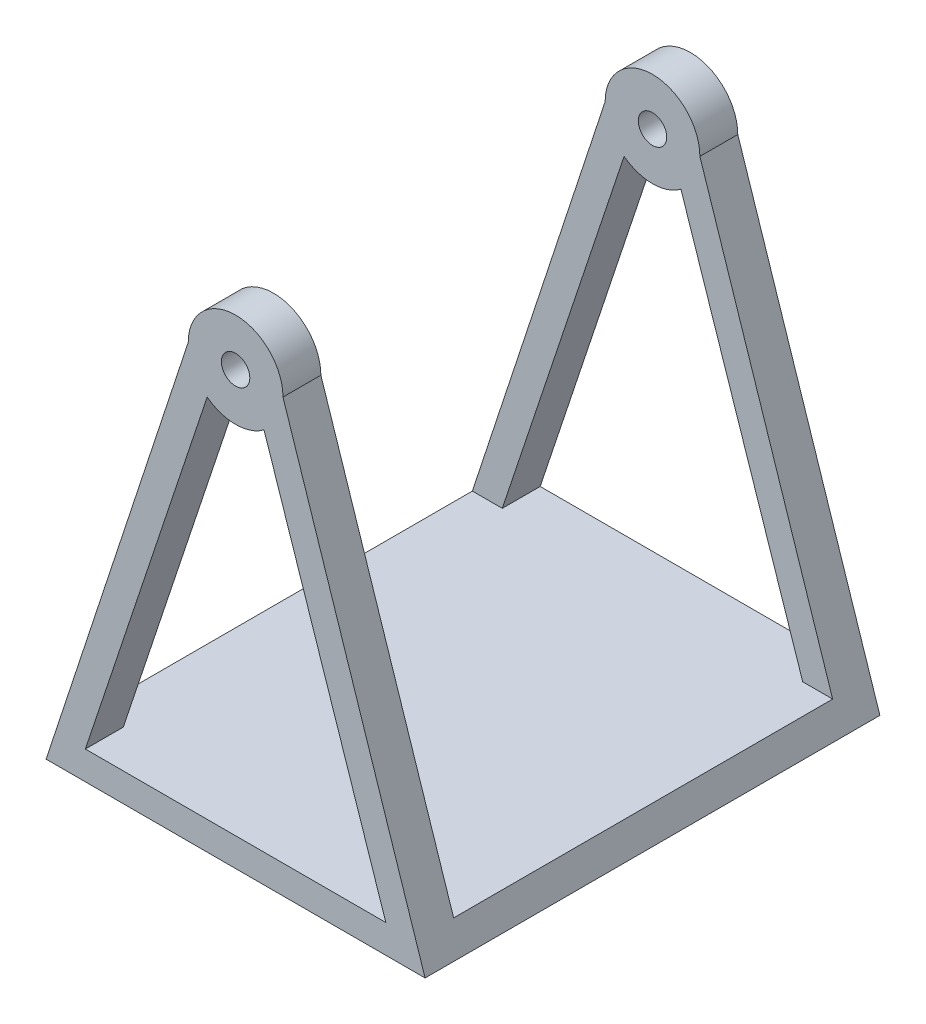
ISO-10303-21;
HEADER;
FILE_DESCRIPTION(('STEP AP214'),'2;1');
FILE_NAME('part.step','',(''),(''),'','','');
FILE_SCHEMA(('AUTOMOTIVE_DESIGN { 1 0 10303 214 1 1 1 1 }'));
ENDSEC;
DATA;
#1=APPLICATION_CONTEXT('core data for automotive mechanical design processes');
#2=APPLICATION_PROTOCOL_DEFINITION('international standard','automotive_design',2000,#1);
#3=PRODUCT_CONTEXT('',#1,'mechanical');
#4=PRODUCT('Part','Part','',(#3));
#5=PRODUCT_RELATED_PRODUCT_CATEGORY('part','',(#4));
#6=PRODUCT_DEFINITION_FORMATION('','',#4);
#7=PRODUCT_DEFINITION_CONTEXT('part definition',#1,'design');
#8=PRODUCT_DEFINITION('design','',#6,#7);
#9=PRODUCT_DEFINITION_SHAPE('','',#8);
#10=(LENGTH_UNIT() NAMED_UNIT(*) SI_UNIT(.MILLI.,.METRE.));
#11=(NAMED_UNIT(*) PLANE_ANGLE_UNIT() SI_UNIT($,.RADIAN.));
#12=(NAMED_UNIT(*) SI_UNIT($,.STERADIAN.) SOLID_ANGLE_UNIT());
#13=UNCERTAINTY_MEASURE_WITH_UNIT(LENGTH_MEASURE(1.E-05),#10,'distance_accuracy_value','');
#14=(GEOMETRIC_REPRESENTATION_CONTEXT(3) GLOBAL_UNCERTAINTY_ASSIGNED_CONTEXT((#13)) GLOBAL_UNIT_ASSIGNED_CONTEXT((#10,
#11,#12)) REPRESENTATION_CONTEXT('',''));
#15=CARTESIAN_POINT('',(0.,0.,0.));
#16=DIRECTION('',(0.,0.,1.));
#17=DIRECTION('',(1.,0.,0.));
#18=AXIS2_PLACEMENT_3D('',#15,#16,#17);
#19=CARTESIAN_POINT('',(0.,0.,100.));
#20=DIRECTION('',(0.,0.,-1.));
#21=DIRECTION('',(-1.,0.,0.));
#22=AXIS2_PLACEMENT_3D('',#19,#20,#21);
#23=CYLINDRICAL_SURFACE('',#22,125.);
#24=CARTESIAN_POINT('',(0.,0.,0.));
#25=DIRECTION('',(0.,0.,1.));
#26=DIRECTION('',(1.,0.,0.));
#27=AXIS2_PLACEMENT_3D('',#24,#25,#26);
#28=CIRCLE('',#27,125.);
#29=CARTESIAN_POINT('',(125.,0.,0.));
#30=VERTEX_POINT('',#29);
#31=CARTESIAN_POINT('',(-125.,0.,0.));
#32=VERTEX_POINT('',#31);
#33=EDGE_CURVE('E151',#30,#32,#28,.T.);
#34=ORIENTED_EDGE('',*,*,#33,.T.);
#35=DIRECTION('',(0.,0.,-1.));
#36=VECTOR('',#35,1.);
#37=CARTESIAN_POINT('',(-125.,0.,100.));
#38=LINE('',#37,#36);
#39=CARTESIAN_POINT('',(-125.,0.,100.));
#40=VERTEX_POINT('',#39);
#41=EDGE_CURVE('E44',#40,#32,#38,.T.);
#42=ORIENTED_EDGE('',*,*,#41,.F.);
#43=CARTESIAN_POINT('',(0.,0.,100.));
#44=DIRECTION('',(0.,0.,1.));
#45=DIRECTION('',(1.,0.,0.));
#46=AXIS2_PLACEMENT_3D('',#43,#44,#45);
#47=CIRCLE('',#46,125.);
#48=CARTESIAN_POINT('',(125.,0.,100.));
#49=VERTEX_POINT('',#48);
#50=EDGE_CURVE('E132',#49,#40,#47,.T.);
#51=ORIENTED_EDGE('',*,*,#50,.F.);
#52=DIRECTION('',(0.,0.,-1.));
#53=VECTOR('',#52,1.);
#54=CARTESIAN_POINT('',(125.,0.,100.));
#55=LINE('',#54,#53);
#56=EDGE_CURVE('E160',#49,#30,#55,.T.);
#57=ORIENTED_EDGE('',*,*,#56,.T.);
#58=EDGE_LOOP('',(#34,#42,#51,#57));
#59=FACE_BOUND('',#58,.T.);
#60=ADVANCED_FACE('F35',(#59),#23,.T.);
#61=CARTESIAN_POINT('',(-112.79296875,37.1061624843034,100.));
#62=DIRECTION('',(0.949917759598167,-0.3125,0.));
#63=DIRECTION('',(0.3125,0.949917759598167,0.));
#64=AXIS2_PLACEMENT_3D('',#61,#62,#63);
#65=PLANE('',#64);
#66=DIRECTION('',(-0.3125,-0.949917759598166,0.));
#67=VECTOR('',#66,1.);
#68=CARTESIAN_POINT('',(-112.79296875,37.1061624843034,0.));
#69=LINE('',#68,#67);
#70=CARTESIAN_POINT('',(-500.,-1139.9013115178,0.));
#71=VERTEX_POINT('',#70);
#72=EDGE_CURVE('E155',#32,#71,#69,.T.);
#73=ORIENTED_EDGE('',*,*,#72,.T.);
#74=DIRECTION('',(0.,0.,-1.));
#75=VECTOR('',#74,1.);
#76=CARTESIAN_POINT('',(-500.,-1139.9013115178,100.));
#77=LINE('',#76,#75);
#78=CARTESIAN_POINT('',(-500.,-1139.9013115178,1200.));
#79=VERTEX_POINT('',#78);
#80=EDGE_CURVE('E164',#79,#71,#77,.T.);
#81=ORIENTED_EDGE('',*,*,#80,.F.);
#82=DIRECTION('',(-0.3125,-0.949917759598166,0.));
#83=VECTOR('',#82,1.);
#84=CARTESIAN_POINT('',(-112.79296875,37.1061624843034,1200.));
#85=LINE('',#84,#83);
#86=CARTESIAN_POINT('',(-125.,0.,1200.));
#87=VERTEX_POINT('',#86);
#88=EDGE_CURVE('E218',#87,#79,#85,.T.);
#89=ORIENTED_EDGE('',*,*,#88,.F.);
#90=DIRECTION('',(0.,0.,1.));
#91=VECTOR('',#90,1.);
#92=CARTESIAN_POINT('',(-125.,0.,1100.));
#93=LINE('',#92,#91);
#94=CARTESIAN_POINT('',(-125.,0.,1100.));
#95=VERTEX_POINT('',#94);
#96=EDGE_CURVE('E186',#95,#87,#93,.T.);
#97=ORIENTED_EDGE('',*,*,#96,.F.);
#98=DIRECTION('',(-0.3125,-0.949917759598166,0.));
#99=VECTOR('',#98,1.);
#100=CARTESIAN_POINT('',(-112.79296875,37.1061624843034,1100.));
#101=LINE('',#100,#99);
#102=CARTESIAN_POINT('',(-475.326811439009,-1064.9013115178,1100.));
#103=VERTEX_POINT('',#102);
#104=EDGE_CURVE('E239',#95,#103,#101,.T.);
#105=ORIENTED_EDGE('',*,*,#104,.T.);
#106=DIRECTION('',(0.,0.,-1.));
#107=VECTOR('',#106,1.);
#108=CARTESIAN_POINT('',(-475.326811439009,-1064.9013115178,600.));
#109=LINE('',#108,#107);
#110=CARTESIAN_POINT('',(-475.326811439009,-1064.9013115178,100.));
#111=VERTEX_POINT('',#110);
#112=EDGE_CURVE('E183',#103,#111,#109,.T.);
#113=ORIENTED_EDGE('',*,*,#112,.T.);
#114=DIRECTION('',(-0.3125,-0.949917759598166,0.));
#115=VECTOR('',#114,1.);
#116=CARTESIAN_POINT('',(-112.79296875,37.1061624843034,100.));
#117=LINE('',#116,#115);
#118=EDGE_CURVE('E114',#40,#111,#117,.T.);
#119=ORIENTED_EDGE('',*,*,#118,.F.);
#120=ORIENTED_EDGE('',*,*,#41,.T.);
#121=EDGE_LOOP('',(#73,#81,#89,#97,#105,#113,#119,#120));
#122=FACE_BOUND('',#121,.T.);
#123=ADVANCED_FACE('F313',(#122),#65,.F.);
#124=CARTESIAN_POINT('',(0.,-1139.9013115178,100.));
#125=DIRECTION('',(0.,1.,0.));
#126=DIRECTION('',(0.,0.,1.));
#127=AXIS2_PLACEMENT_3D('',#124,#125,#126);
#128=PLANE('',#127);
#129=DIRECTION('',(1.,0.,0.));
#130=VECTOR('',#129,1.);
#131=CARTESIAN_POINT('',(0.,-1139.9013115178,0.));
#132=LINE('',#131,#130);
#133=CARTESIAN_POINT('',(500.,-1139.9013115178,0.));
#134=VERTEX_POINT('',#133);
#135=EDGE_CURVE('E157',#71,#134,#132,.T.);
#136=ORIENTED_EDGE('',*,*,#135,.T.);
#137=DIRECTION('',(0.,0.,-1.));
#138=VECTOR('',#137,1.);
#139=CARTESIAN_POINT('',(500.,-1139.9013115178,100.));
#140=LINE('',#139,#138);
#141=CARTESIAN_POINT('',(500.,-1139.9013115178,1200.));
#142=VERTEX_POINT('',#141);
#143=EDGE_CURVE('E162',#142,#134,#140,.T.);
#144=ORIENTED_EDGE('',*,*,#143,.F.);
#145=DIRECTION('',(1.,0.,0.));
#146=VECTOR('',#145,1.);
#147=CARTESIAN_POINT('',(0.,-1139.9013115178,1200.));
#148=LINE('',#147,#146);
#149=EDGE_CURVE('E215',#79,#142,#148,.T.);
#150=ORIENTED_EDGE('',*,*,#149,.F.);
#151=ORIENTED_EDGE('',*,*,#80,.T.);
#152=EDGE_LOOP('',(#136,#144,#150,#151));
#153=FACE_BOUND('',#152,.T.);
#154=ADVANCED_FACE('F327',(#153),#128,.F.);
#155=CARTESIAN_POINT('',(-37.530451985883,12.499992581412,100.));
#156=DIRECTION('',(0.94876030800897,-0.315996642302928,0.));
#157=DIRECTION('',(0.315996642302928,0.94876030800897,0.));
#158=AXIS2_PLACEMENT_3D('',#155,#156,#157);
#159=PLANE('',#158);
#160=DIRECTION('',(-0.315996642302928,-0.94876030800897,0.));
#161=VECTOR('',#160,1.);
#162=CARTESIAN_POINT('',(-37.530451985883,12.499992581412,0.));
#163=LINE('',#162,#161);
#164=CARTESIAN_POINT('',(-75.,-100.,0.));
#165=VERTEX_POINT('',#164);
#166=CARTESIAN_POINT('',(-396.372608043836,-1064.9013115178,0.));
#167=VERTEX_POINT('',#166);
#168=EDGE_CURVE('E145',#165,#167,#163,.T.);
#169=ORIENTED_EDGE('',*,*,#168,.F.);
#170=DIRECTION('',(0.,0.,-1.));
#171=VECTOR('',#170,1.);
#172=CARTESIAN_POINT('',(-75.,-100.,100.));
#173=LINE('',#172,#171);
#174=CARTESIAN_POINT('',(-75.,-100.,100.));
#175=VERTEX_POINT('',#174);
#176=EDGE_CURVE('E39',#175,#165,#173,.T.);
#177=ORIENTED_EDGE('',*,*,#176,.F.);
#178=DIRECTION('',(-0.315996642302928,-0.94876030800897,0.));
#179=VECTOR('',#178,1.);
#180=CARTESIAN_POINT('',(-37.530451985883,12.499992581412,100.));
#181=LINE('',#180,#179);
#182=CARTESIAN_POINT('',(-396.372608043836,-1064.9013115178,100.));
#183=VERTEX_POINT('',#182);
#184=EDGE_CURVE('E113',#175,#183,#181,.T.);
#185=ORIENTED_EDGE('',*,*,#184,.T.);
#186=DIRECTION('',(0.,0.,-1.));
#187=VECTOR('',#186,1.);
#188=CARTESIAN_POINT('',(-396.372608043836,-1064.9013115178,100.));
#189=LINE('',#188,#187);
#190=EDGE_CURVE('E119',#183,#167,#189,.T.);
#191=ORIENTED_EDGE('',*,*,#190,.T.);
#192=EDGE_LOOP('',(#169,#177,#185,#191));
#193=FACE_BOUND('',#192,.T.);
#194=ADVANCED_FACE('F37',(#193),#159,.T.);
#195=CARTESIAN_POINT('',(75.,-100.,0.));
#196=VERTEX_POINT('',#195);
#197=EDGE_CURVE('E147',#165,#196,#28,.T.);
#198=ORIENTED_EDGE('',*,*,#197,.T.);
#199=DIRECTION('',(0.,0.,-1.));
#200=VECTOR('',#199,1.);
#201=CARTESIAN_POINT('',(75.,-100.,100.));
#202=LINE('',#201,#200);
#203=CARTESIAN_POINT('',(75.,-100.,100.));
#204=VERTEX_POINT('',#203);
#205=EDGE_CURVE('E169',#204,#196,#202,.T.);
#206=ORIENTED_EDGE('',*,*,#205,.F.);
#207=EDGE_CURVE('E127',#175,#204,#47,.T.);
#208=ORIENTED_EDGE('',*,*,#207,.F.);
#209=ORIENTED_EDGE('',*,*,#176,.T.);
#210=EDGE_LOOP('',(#198,#206,#208,#209));
#211=FACE_BOUND('',#210,.T.);
#212=ADVANCED_FACE('F175',(#211),#23,.T.);
#213=CARTESIAN_POINT('',(37.530451985883,12.499992581412,100.));
#214=DIRECTION('',(-0.94876030800897,-0.315996642302928,0.));
#215=DIRECTION('',(0.315996642302928,-0.94876030800897,0.));
#216=AXIS2_PLACEMENT_3D('',#213,#214,#215);
#217=PLANE('',#216);
#218=DIRECTION('',(-0.315996642302928,0.94876030800897,0.));
#219=VECTOR('',#218,1.);
#220=CARTESIAN_POINT('',(37.530451985883,12.499992581412,0.));
#221=LINE('',#220,#219);
#222=CARTESIAN_POINT('',(396.372608043836,-1064.9013115178,0.));
#223=VERTEX_POINT('',#222);
#224=EDGE_CURVE('E150',#223,#196,#221,.T.);
#225=ORIENTED_EDGE('',*,*,#224,.F.);
#226=DIRECTION('',(0.,0.,-1.));
#227=VECTOR('',#226,1.);
#228=CARTESIAN_POINT('',(396.372608043836,-1064.9013115178,100.));
#229=LINE('',#228,#227);
#230=CARTESIAN_POINT('',(396.372608043836,-1064.9013115178,100.));
#231=VERTEX_POINT('',#230);
#232=EDGE_CURVE('E124',#231,#223,#229,.T.);
#233=ORIENTED_EDGE('',*,*,#232,.F.);
#234=DIRECTION('',(-0.315996642302928,0.94876030800897,0.));
#235=VECTOR('',#234,1.);
#236=CARTESIAN_POINT('',(37.530451985883,12.499992581412,100.));
#237=LINE('',#236,#235);
#238=EDGE_CURVE('E130',#231,#204,#237,.T.);
#239=ORIENTED_EDGE('',*,*,#238,.T.);
#240=ORIENTED_EDGE('',*,*,#205,.T.);
#241=EDGE_LOOP('',(#225,#233,#239,#240));
#242=FACE_BOUND('',#241,.T.);
#243=ADVANCED_FACE('F179',(#242),#217,.T.);
#244=CARTESIAN_POINT('',(112.79296875,37.1061624843034,100.));
#245=DIRECTION('',(-0.949917759598167,-0.3125,0.));
#246=DIRECTION('',(0.3125,-0.949917759598167,0.));
#247=AXIS2_PLACEMENT_3D('',#244,#245,#246);
#248=PLANE('',#247);
#249=DIRECTION('',(-0.3125,0.949917759598166,0.));
#250=VECTOR('',#249,1.);
#251=CARTESIAN_POINT('',(112.79296875,37.1061624843034,0.));
#252=LINE('',#251,#250);
#253=EDGE_CURVE('E91',#134,#30,#252,.T.);
#254=ORIENTED_EDGE('',*,*,#253,.T.);
#255=ORIENTED_EDGE('',*,*,#56,.F.);
#256=DIRECTION('',(-0.3125,0.949917759598166,0.));
#257=VECTOR('',#256,1.);
#258=CARTESIAN_POINT('',(112.79296875,37.1061624843034,100.));
#259=LINE('',#258,#257);
#260=CARTESIAN_POINT('',(475.326811439009,-1064.9013115178,100.));
#261=VERTEX_POINT('',#260);
#262=EDGE_CURVE('E57',#261,#49,#259,.T.);
#263=ORIENTED_EDGE('',*,*,#262,.F.);
#264=DIRECTION('',(0.,0.,-1.));
#265=VECTOR('',#264,1.);
#266=CARTESIAN_POINT('',(475.326811439009,-1064.9013115178,600.));
#267=LINE('',#266,#265);
#268=CARTESIAN_POINT('',(475.326811439009,-1064.9013115178,1100.));
#269=VERTEX_POINT('',#268);
#270=EDGE_CURVE('E136',#269,#261,#267,.T.);
#271=ORIENTED_EDGE('',*,*,#270,.F.);
#272=DIRECTION('',(-0.3125,0.949917759598166,0.));
#273=VECTOR('',#272,1.);
#274=CARTESIAN_POINT('',(112.79296875,37.1061624843034,1100.));
#275=LINE('',#274,#273);
#276=CARTESIAN_POINT('',(125.,0.,1100.));
#277=VERTEX_POINT('',#276);
#278=EDGE_CURVE('E236',#269,#277,#275,.T.);
#279=ORIENTED_EDGE('',*,*,#278,.T.);
#280=DIRECTION('',(0.,0.,1.));
#281=VECTOR('',#280,1.);
#282=CARTESIAN_POINT('',(125.,0.,1100.));
#283=LINE('',#282,#281);
#284=CARTESIAN_POINT('',(125.,0.,1200.));
#285=VERTEX_POINT('',#284);
#286=EDGE_CURVE('E193',#277,#285,#283,.T.);
#287=ORIENTED_EDGE('',*,*,#286,.T.);
#288=DIRECTION('',(-0.3125,0.949917759598166,0.));
#289=VECTOR('',#288,1.);
#290=CARTESIAN_POINT('',(112.79296875,37.1061624843034,1200.));
#291=LINE('',#290,#289);
#292=EDGE_CURVE('E212',#142,#285,#291,.T.);
#293=ORIENTED_EDGE('',*,*,#292,.F.);
#294=ORIENTED_EDGE('',*,*,#143,.T.);
#295=EDGE_LOOP('',(#254,#255,#263,#271,#279,#287,#293,#294));
#296=FACE_BOUND('',#295,.T.);
#297=ADVANCED_FACE('F306',(#296),#248,.F.);
#298=CARTESIAN_POINT('',(0.,-1064.9013115178,100.));
#299=DIRECTION('',(0.,1.,0.));
#300=DIRECTION('',(0.,0.,1.));
#301=AXIS2_PLACEMENT_3D('',#298,#299,#300);
#302=PLANE('',#301);
#303=DIRECTION('',(1.,0.,0.));
#304=VECTOR('',#303,1.);
#305=CARTESIAN_POINT('',(0.,-1064.9013115178,0.));
#306=LINE('',#305,#304);
#307=EDGE_CURVE('E122',#167,#223,#306,.T.);
#308=ORIENTED_EDGE('',*,*,#307,.F.);
#309=ORIENTED_EDGE('',*,*,#190,.F.);
#310=DIRECTION('',(-1.,0.,0.));
#311=VECTOR('',#310,1.);
#312=CARTESIAN_POINT('',(-475.326811439009,-1064.9013115178,100.));
#313=LINE('',#312,#311);
#314=EDGE_CURVE('E11',#183,#111,#313,.T.);
#315=ORIENTED_EDGE('',*,*,#314,.T.);
#316=ORIENTED_EDGE('',*,*,#112,.F.);
#317=DIRECTION('',(-1.,0.,0.));
#318=VECTOR('',#317,1.);
#319=CARTESIAN_POINT('',(-475.326811439009,-1064.9013115178,1100.));
#320=LINE('',#319,#318);
#321=CARTESIAN_POINT('',(-396.372608043836,-1064.9013115178,1100.));
#322=VERTEX_POINT('',#321);
#323=EDGE_CURVE('E184',#322,#103,#320,.T.);
#324=ORIENTED_EDGE('',*,*,#323,.F.);
#325=DIRECTION('',(0.,0.,1.));
#326=VECTOR('',#325,1.);
#327=CARTESIAN_POINT('',(-396.372608043836,-1064.9013115178,1100.));
#328=LINE('',#327,#326);
#329=CARTESIAN_POINT('',(-396.372608043836,-1064.9013115178,1200.));
#330=VERTEX_POINT('',#329);
#331=EDGE_CURVE('E200',#322,#330,#328,.T.);
#332=ORIENTED_EDGE('',*,*,#331,.T.);
#333=DIRECTION('',(1.,0.,0.));
#334=VECTOR('',#333,1.);
#335=CARTESIAN_POINT('',(0.,-1064.9013115178,1200.));
#336=LINE('',#335,#334);
#337=CARTESIAN_POINT('',(396.372608043836,-1064.9013115178,1200.));
#338=VERTEX_POINT('',#337);
#339=EDGE_CURVE('E222',#330,#338,#336,.T.);
#340=ORIENTED_EDGE('',*,*,#339,.T.);
#341=DIRECTION('',(0.,0.,1.));
#342=VECTOR('',#341,1.);
#343=CARTESIAN_POINT('',(396.372608043836,-1064.9013115178,1100.));
#344=LINE('',#343,#342);
#345=CARTESIAN_POINT('',(396.372608043836,-1064.9013115178,1100.));
#346=VERTEX_POINT('',#345);
#347=EDGE_CURVE('E197',#346,#338,#344,.T.);
#348=ORIENTED_EDGE('',*,*,#347,.F.);
#349=EDGE_CURVE('E188',#269,#346,#320,.T.);
#350=ORIENTED_EDGE('',*,*,#349,.F.);
#351=ORIENTED_EDGE('',*,*,#270,.T.);
#352=EDGE_CURVE('E46',#261,#231,#313,.T.);
#353=ORIENTED_EDGE('',*,*,#352,.T.);
#354=ORIENTED_EDGE('',*,*,#232,.T.);
#355=EDGE_LOOP('',(#308,#309,#315,#316,#324,#332,#340,#348,#350,#351,#353,#354));
#356=FACE_BOUND('',#355,.T.);
#357=ADVANCED_FACE('F120',(#356),#302,.T.);
#358=CARTESIAN_POINT('',(0.,0.,100.));
#359=DIRECTION('',(0.,0.,-1.));
#360=DIRECTION('',(-1.,0.,0.));
#361=AXIS2_PLACEMENT_3D('',#358,#359,#360);
#362=CYLINDRICAL_SURFACE('',#361,37.5);
#363=CARTESIAN_POINT('',(0.,0.,100.));
#364=DIRECTION('',(0.,0.,1.));
#365=DIRECTION('',(1.,0.,0.));
#366=AXIS2_PLACEMENT_3D('',#363,#364,#365);
#367=CIRCLE('',#366,37.5);
#368=CARTESIAN_POINT('',(37.5,0.,100.));
#369=VERTEX_POINT('',#368);
#370=EDGE_CURVE('E125',#369,#369,#367,.T.);
#371=ORIENTED_EDGE('',*,*,#370,.T.);
#372=EDGE_LOOP('',(#371));
#373=FACE_BOUND('',#372,.T.);
#374=CARTESIAN_POINT('',(0.,0.,0.));
#375=DIRECTION('',(0.,0.,1.));
#376=DIRECTION('',(1.,0.,0.));
#377=AXIS2_PLACEMENT_3D('',#374,#375,#376);
#378=CIRCLE('',#377,37.5);
#379=CARTESIAN_POINT('',(37.5,0.,0.));
#380=VERTEX_POINT('',#379);
#381=EDGE_CURVE('E128',#380,#380,#378,.T.);
#382=ORIENTED_EDGE('',*,*,#381,.F.);
#383=EDGE_LOOP('',(#382));
#384=FACE_BOUND('',#383,.T.);
#385=ADVANCED_FACE('F334',(#373,#384),#362,.F.);
#386=CARTESIAN_POINT('',(0.,0.,100.));
#387=DIRECTION('',(0.,0.,1.));
#388=DIRECTION('',(1.,0.,0.));
#389=AXIS2_PLACEMENT_3D('',#386,#387,#388);
#390=PLANE('',#389);
#391=ORIENTED_EDGE('',*,*,#352,.F.);
#392=ORIENTED_EDGE('',*,*,#262,.T.);
#393=ORIENTED_EDGE('',*,*,#50,.T.);
#394=ORIENTED_EDGE('',*,*,#118,.T.);
#395=ORIENTED_EDGE('',*,*,#314,.F.);
#396=ORIENTED_EDGE('',*,*,#184,.F.);
#397=ORIENTED_EDGE('',*,*,#207,.T.);
#398=ORIENTED_EDGE('',*,*,#238,.F.);
#399=EDGE_LOOP('',(#391,#392,#393,#394,#395,#396,#397,#398));
#400=FACE_BOUND('',#399,.T.);
#401=ORIENTED_EDGE('',*,*,#370,.F.);
#402=EDGE_LOOP('',(#401));
#403=FACE_BOUND('',#402,.T.);
#404=ADVANCED_FACE('F111',(#400,#403),#390,.T.);
#405=CARTESIAN_POINT('',(0.,0.,0.));
#406=DIRECTION('',(0.,0.,1.));
#407=DIRECTION('',(1.,0.,0.));
#408=AXIS2_PLACEMENT_3D('',#405,#406,#407);
#409=PLANE('',#408);
#410=ORIENTED_EDGE('',*,*,#168,.T.);
#411=ORIENTED_EDGE('',*,*,#307,.T.);
#412=ORIENTED_EDGE('',*,*,#224,.T.);
#413=ORIENTED_EDGE('',*,*,#197,.F.);
#414=EDGE_LOOP('',(#410,#411,#412,#413));
#415=FACE_BOUND('',#414,.T.);
#416=ORIENTED_EDGE('',*,*,#33,.F.);
#417=ORIENTED_EDGE('',*,*,#253,.F.);
#418=ORIENTED_EDGE('',*,*,#135,.F.);
#419=ORIENTED_EDGE('',*,*,#72,.F.);
#420=EDGE_LOOP('',(#416,#417,#418,#419));
#421=FACE_BOUND('',#420,.T.);
#422=ORIENTED_EDGE('',*,*,#381,.T.);
#423=EDGE_LOOP('',(#422));
#424=FACE_BOUND('',#423,.T.);
#425=ADVANCED_FACE('F177',(#415,#421,#424),#409,.F.);
#426=CARTESIAN_POINT('',(0.,0.,1100.));
#427=DIRECTION('',(0.,0.,1.));
#428=DIRECTION('',(-1.,0.,0.));
#429=AXIS2_PLACEMENT_3D('',#426,#427,#428);
#430=CYLINDRICAL_SURFACE('',#429,125.);
#431=CARTESIAN_POINT('',(0.,0.,1200.));
#432=DIRECTION('',(0.,0.,1.));
#433=DIRECTION('',(1.,0.,0.));
#434=AXIS2_PLACEMENT_3D('',#431,#432,#433);
#435=CIRCLE('',#434,125.);
#436=EDGE_CURVE('E221',#285,#87,#435,.T.);
#437=ORIENTED_EDGE('',*,*,#436,.F.);
#438=ORIENTED_EDGE('',*,*,#286,.F.);
#439=CARTESIAN_POINT('',(0.,0.,1100.));
#440=DIRECTION('',(0.,0.,1.));
#441=DIRECTION('',(1.,0.,0.));
#442=AXIS2_PLACEMENT_3D('',#439,#440,#441);
#443=CIRCLE('',#442,125.);
#444=EDGE_CURVE('E242',#277,#95,#443,.T.);
#445=ORIENTED_EDGE('',*,*,#444,.T.);
#446=ORIENTED_EDGE('',*,*,#96,.T.);
#447=EDGE_LOOP('',(#437,#438,#445,#446));
#448=FACE_BOUND('',#447,.T.);
#449=ADVANCED_FACE('F320',(#448),#430,.T.);
#450=CARTESIAN_POINT('',(-37.530451985883,12.499992581412,1100.));
#451=DIRECTION('',(0.94876030800897,-0.315996642302928,0.));
#452=DIRECTION('',(0.315996642302928,0.94876030800897,0.));
#453=AXIS2_PLACEMENT_3D('',#450,#451,#452);
#454=PLANE('',#453);
#455=DIRECTION('',(-0.315996642302928,-0.94876030800897,0.));
#456=VECTOR('',#455,1.);
#457=CARTESIAN_POINT('',(-37.530451985883,12.499992581412,1200.));
#458=LINE('',#457,#456);
#459=CARTESIAN_POINT('',(-75.,-100.,1200.));
#460=VERTEX_POINT('',#459);
#461=EDGE_CURVE('E231',#460,#330,#458,.T.);
#462=ORIENTED_EDGE('',*,*,#461,.T.);
#463=ORIENTED_EDGE('',*,*,#331,.F.);
#464=DIRECTION('',(-0.315996642302928,-0.94876030800897,0.));
#465=VECTOR('',#464,1.);
#466=CARTESIAN_POINT('',(-37.530451985883,12.499992581412,1100.));
#467=LINE('',#466,#465);
#468=CARTESIAN_POINT('',(-75.,-100.,1100.));
#469=VERTEX_POINT('',#468);
#470=EDGE_CURVE('E211',#469,#322,#467,.T.);
#471=ORIENTED_EDGE('',*,*,#470,.F.);
#472=DIRECTION('',(0.,0.,1.));
#473=VECTOR('',#472,1.);
#474=CARTESIAN_POINT('',(-75.,-100.,1100.));
#475=LINE('',#474,#473);
#476=EDGE_CURVE('E190',#469,#460,#475,.T.);
#477=ORIENTED_EDGE('',*,*,#476,.T.);
#478=EDGE_LOOP('',(#462,#463,#471,#477));
#479=FACE_BOUND('',#478,.T.);
#480=ADVANCED_FACE('F381',(#479),#454,.T.);
#481=CARTESIAN_POINT('',(75.,-100.,1200.));
#482=VERTEX_POINT('',#481);
#483=EDGE_CURVE('E228',#460,#482,#435,.T.);
#484=ORIENTED_EDGE('',*,*,#483,.F.);
#485=ORIENTED_EDGE('',*,*,#476,.F.);
#486=CARTESIAN_POINT('',(75.,-100.,1100.));
#487=VERTEX_POINT('',#486);
#488=EDGE_CURVE('E246',#469,#487,#443,.T.);
#489=ORIENTED_EDGE('',*,*,#488,.T.);
#490=DIRECTION('',(0.,0.,1.));
#491=VECTOR('',#490,1.);
#492=CARTESIAN_POINT('',(75.,-100.,1100.));
#493=LINE('',#492,#491);
#494=EDGE_CURVE('E194',#487,#482,#493,.T.);
#495=ORIENTED_EDGE('',*,*,#494,.T.);
#496=EDGE_LOOP('',(#484,#485,#489,#495));
#497=FACE_BOUND('',#496,.T.);
#498=ADVANCED_FACE('F276',(#497),#430,.T.);
#499=CARTESIAN_POINT('',(37.530451985883,12.499992581412,1100.));
#500=DIRECTION('',(-0.94876030800897,-0.315996642302928,0.));
#501=DIRECTION('',(0.315996642302928,-0.94876030800897,0.));
#502=AXIS2_PLACEMENT_3D('',#499,#500,#501);
#503=PLANE('',#502);
#504=DIRECTION('',(-0.315996642302928,0.94876030800897,0.));
#505=VECTOR('',#504,1.);
#506=CARTESIAN_POINT('',(37.530451985883,12.499992581412,1200.));
#507=LINE('',#506,#505);
#508=EDGE_CURVE('E225',#338,#482,#507,.T.);
#509=ORIENTED_EDGE('',*,*,#508,.T.);
#510=ORIENTED_EDGE('',*,*,#494,.F.);
#511=DIRECTION('',(-0.315996642302928,0.94876030800897,0.));
#512=VECTOR('',#511,1.);
#513=CARTESIAN_POINT('',(37.530451985883,12.499992581412,1100.));
#514=LINE('',#513,#512);
#515=EDGE_CURVE('E243',#346,#487,#514,.T.);
#516=ORIENTED_EDGE('',*,*,#515,.F.);
#517=ORIENTED_EDGE('',*,*,#347,.T.);
#518=EDGE_LOOP('',(#509,#510,#516,#517));
#519=FACE_BOUND('',#518,.T.);
#520=ADVANCED_FACE('F269',(#519),#503,.T.);
#521=CARTESIAN_POINT('',(0.,0.,1100.));
#522=DIRECTION('',(0.,0.,1.));
#523=DIRECTION('',(-1.,0.,0.));
#524=AXIS2_PLACEMENT_3D('',#521,#522,#523);
#525=CYLINDRICAL_SURFACE('',#524,37.5);
#526=CARTESIAN_POINT('',(0.,0.,1100.));
#527=DIRECTION('',(0.,0.,1.));
#528=DIRECTION('',(1.,0.,0.));
#529=AXIS2_PLACEMENT_3D('',#526,#527,#528);
#530=CIRCLE('',#529,37.5);
#531=CARTESIAN_POINT('',(37.5,0.,1100.));
#532=VERTEX_POINT('',#531);
#533=EDGE_CURVE('E203',#532,#532,#530,.T.);
#534=ORIENTED_EDGE('',*,*,#533,.F.);
#535=EDGE_LOOP('',(#534));
#536=FACE_BOUND('',#535,.T.);
#537=CARTESIAN_POINT('',(0.,0.,1200.));
#538=DIRECTION('',(0.,0.,1.));
#539=DIRECTION('',(1.,0.,0.));
#540=AXIS2_PLACEMENT_3D('',#537,#538,#539);
#541=CIRCLE('',#540,37.5);
#542=CARTESIAN_POINT('',(37.5,0.,1200.));
#543=VERTEX_POINT('',#542);
#544=EDGE_CURVE('E208',#543,#543,#541,.T.);
#545=ORIENTED_EDGE('',*,*,#544,.T.);
#546=EDGE_LOOP('',(#545));
#547=FACE_BOUND('',#546,.T.);
#548=ADVANCED_FACE('F406',(#536,#547),#525,.F.);
#549=CARTESIAN_POINT('',(0.,0.,1100.));
#550=DIRECTION('',(0.,0.,-1.));
#551=DIRECTION('',(1.,0.,0.));
#552=AXIS2_PLACEMENT_3D('',#549,#550,#551);
#553=PLANE('',#552);
#554=ORIENTED_EDGE('',*,*,#349,.T.);
#555=ORIENTED_EDGE('',*,*,#515,.T.);
#556=ORIENTED_EDGE('',*,*,#488,.F.);
#557=ORIENTED_EDGE('',*,*,#470,.T.);
#558=ORIENTED_EDGE('',*,*,#323,.T.);
#559=ORIENTED_EDGE('',*,*,#104,.F.);
#560=ORIENTED_EDGE('',*,*,#444,.F.);
#561=ORIENTED_EDGE('',*,*,#278,.F.);
#562=EDGE_LOOP('',(#554,#555,#556,#557,#558,#559,#560,#561));
#563=FACE_BOUND('',#562,.T.);
#564=ORIENTED_EDGE('',*,*,#533,.T.);
#565=EDGE_LOOP('',(#564));
#566=FACE_BOUND('',#565,.T.);
#567=ADVANCED_FACE('F255',(#563,#566),#553,.T.);
#568=CARTESIAN_POINT('',(0.,0.,1200.));
#569=DIRECTION('',(0.,0.,-1.));
#570=DIRECTION('',(1.,0.,0.));
#571=AXIS2_PLACEMENT_3D('',#568,#569,#570);
#572=PLANE('',#571);
#573=ORIENTED_EDGE('',*,*,#461,.F.);
#574=ORIENTED_EDGE('',*,*,#483,.T.);
#575=ORIENTED_EDGE('',*,*,#508,.F.);
#576=ORIENTED_EDGE('',*,*,#339,.F.);
#577=EDGE_LOOP('',(#573,#574,#575,#576));
#578=FACE_BOUND('',#577,.T.);
#579=ORIENTED_EDGE('',*,*,#436,.T.);
#580=ORIENTED_EDGE('',*,*,#88,.T.);
#581=ORIENTED_EDGE('',*,*,#149,.T.);
#582=ORIENTED_EDGE('',*,*,#292,.T.);
#583=EDGE_LOOP('',(#579,#580,#581,#582));
#584=FACE_BOUND('',#583,.T.);
#585=ORIENTED_EDGE('',*,*,#544,.F.);
#586=EDGE_LOOP('',(#585));
#587=FACE_BOUND('',#586,.T.);
#588=ADVANCED_FACE('F324',(#578,#584,#587),#572,.F.);
#589=CLOSED_SHELL('',(#60,#123,#154,#194,#212,#243,#297,#357,#385,#404,#425,#449,#480,#498,#520,
#548,#567,#588));
#590=MANIFOLD_SOLID_BREP('B2',#589);
#591=ADVANCED_BREP_SHAPE_REPRESENTATION('',(#18,#590),#14);
#592=SHAPE_DEFINITION_REPRESENTATION(#9,#591);
ENDSEC;
END-ISO-10303-21;
